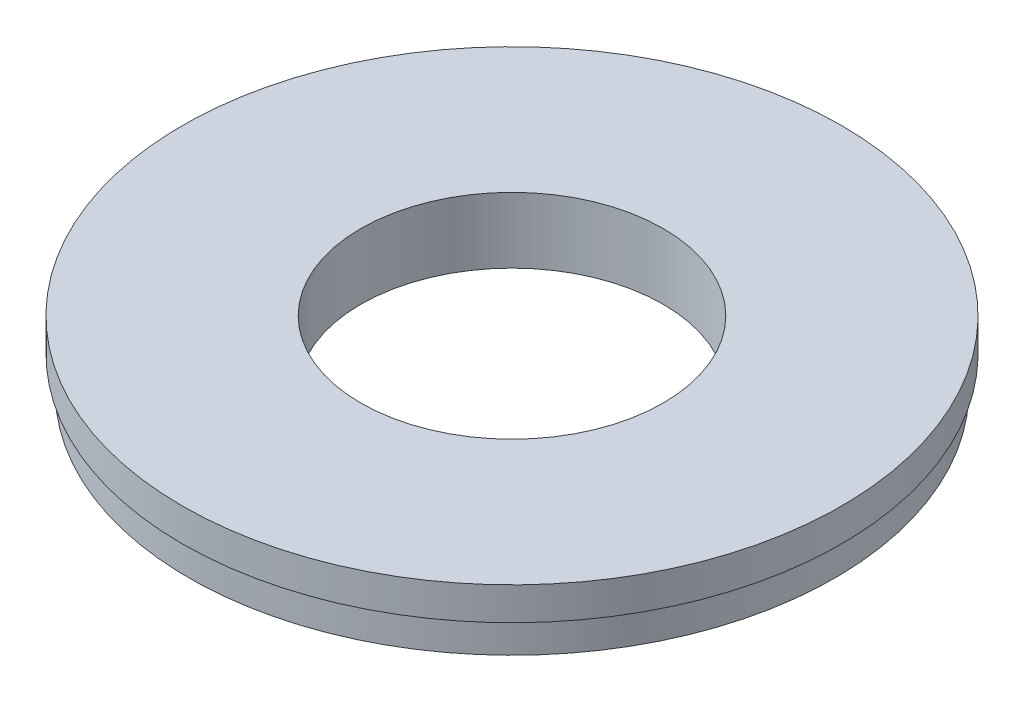
ISO-10303-21;
HEADER;
FILE_DESCRIPTION(('STEP AP214'),'2;1');
FILE_NAME('part.step','',(''),(''),'','','');
FILE_SCHEMA(('AUTOMOTIVE_DESIGN { 1 0 10303 214 1 1 1 1 }'));
ENDSEC;
DATA;
#1=APPLICATION_CONTEXT('core data for automotive mechanical design processes');
#2=APPLICATION_PROTOCOL_DEFINITION('international standard','automotive_design',2000,#1);
#3=PRODUCT_CONTEXT('',#1,'mechanical');
#4=PRODUCT('Part','Part','',(#3));
#5=PRODUCT_RELATED_PRODUCT_CATEGORY('part','',(#4));
#6=PRODUCT_DEFINITION_FORMATION('','',#4);
#7=PRODUCT_DEFINITION_CONTEXT('part definition',#1,'design');
#8=PRODUCT_DEFINITION('design','',#6,#7);
#9=PRODUCT_DEFINITION_SHAPE('','',#8);
#10=(LENGTH_UNIT() NAMED_UNIT(*) SI_UNIT(.MILLI.,.METRE.));
#11=(NAMED_UNIT(*) PLANE_ANGLE_UNIT() SI_UNIT($,.RADIAN.));
#12=(NAMED_UNIT(*) SI_UNIT($,.STERADIAN.) SOLID_ANGLE_UNIT());
#13=UNCERTAINTY_MEASURE_WITH_UNIT(LENGTH_MEASURE(1.E-05),#10,'distance_accuracy_value','');
#14=(GEOMETRIC_REPRESENTATION_CONTEXT(3) GLOBAL_UNCERTAINTY_ASSIGNED_CONTEXT((#13)) GLOBAL_UNIT_ASSIGNED_CONTEXT((#10,
#11,#12)) REPRESENTATION_CONTEXT('',''));
#15=CARTESIAN_POINT('',(0.,0.,0.));
#16=DIRECTION('',(0.,0.,1.));
#17=DIRECTION('',(1.,0.,0.));
#18=AXIS2_PLACEMENT_3D('',#15,#16,#17);
#19=CARTESIAN_POINT('',(59.944,5.969,0.));
#20=DIRECTION('',(0.,-1.,0.));
#21=DIRECTION('',(0.,0.,-1.));
#22=AXIS2_PLACEMENT_3D('',#19,#20,#21);
#23=PLANE('',#22);
#24=CARTESIAN_POINT('',(0.,5.969,0.));
#25=DIRECTION('',(0.,-1.,0.));
#26=DIRECTION('',(0.,0.,-1.));
#27=AXIS2_PLACEMENT_3D('',#24,#25,#26);
#28=CIRCLE('',#27,59.944);
#29=CARTESIAN_POINT('',(0.,5.969,-59.944));
#30=VERTEX_POINT('',#29);
#31=EDGE_CURVE('E10',#30,#30,#28,.T.);
#32=ORIENTED_EDGE('',*,*,#31,.T.);
#33=EDGE_LOOP('',(#32));
#34=FACE_BOUND('',#33,.T.);
#35=CARTESIAN_POINT('',(0.,5.969,0.));
#36=DIRECTION('',(0.,-1.,0.));
#37=DIRECTION('',(0.,0.,-1.));
#38=AXIS2_PLACEMENT_3D('',#35,#36,#37);
#39=CIRCLE('',#38,58.7502);
#40=CARTESIAN_POINT('',(0.,5.969,-58.7502));
#41=VERTEX_POINT('',#40);
#42=EDGE_CURVE('E54',#41,#41,#39,.T.);
#43=ORIENTED_EDGE('',*,*,#42,.F.);
#44=EDGE_LOOP('',(#43));
#45=FACE_BOUND('',#44,.T.);
#46=ADVANCED_FACE('F32',(#34,#45),#23,.T.);
#47=CARTESIAN_POINT('',(0.,0.,0.));
#48=DIRECTION('',(0.,-1.,0.));
#49=DIRECTION('',(0.,0.,-1.));
#50=AXIS2_PLACEMENT_3D('',#47,#48,#49);
#51=CYLINDRICAL_SURFACE('',#50,59.944);
#52=CARTESIAN_POINT('',(0.,11.938,0.));
#53=DIRECTION('',(0.,-1.,0.));
#54=DIRECTION('',(0.,0.,-1.));
#55=AXIS2_PLACEMENT_3D('',#52,#53,#54);
#56=CIRCLE('',#55,59.944);
#57=CARTESIAN_POINT('',(0.,11.938,-59.944));
#58=VERTEX_POINT('',#57);
#59=EDGE_CURVE('E38',#58,#58,#56,.T.);
#60=ORIENTED_EDGE('',*,*,#59,.T.);
#61=EDGE_LOOP('',(#60));
#62=FACE_BOUND('',#61,.T.);
#63=ORIENTED_EDGE('',*,*,#31,.F.);
#64=EDGE_LOOP('',(#63));
#65=FACE_BOUND('',#64,.T.);
#66=ADVANCED_FACE('F62',(#62,#65),#51,.T.);
#67=CARTESIAN_POINT('',(27.5,11.938,0.));
#68=DIRECTION('',(0.,1.,0.));
#69=DIRECTION('',(0.,0.,1.));
#70=AXIS2_PLACEMENT_3D('',#67,#68,#69);
#71=PLANE('',#70);
#72=CARTESIAN_POINT('',(0.,11.938,0.));
#73=DIRECTION('',(0.,-1.,0.));
#74=DIRECTION('',(0.,0.,-1.));
#75=AXIS2_PLACEMENT_3D('',#72,#73,#74);
#76=CIRCLE('',#75,27.5);
#77=CARTESIAN_POINT('',(0.,11.938,-27.5));
#78=VERTEX_POINT('',#77);
#79=EDGE_CURVE('E42',#78,#78,#76,.T.);
#80=ORIENTED_EDGE('',*,*,#79,.T.);
#81=EDGE_LOOP('',(#80));
#82=FACE_BOUND('',#81,.T.);
#83=ORIENTED_EDGE('',*,*,#59,.F.);
#84=EDGE_LOOP('',(#83));
#85=FACE_BOUND('',#84,.T.);
#86=ADVANCED_FACE('F66',(#82,#85),#71,.T.);
#87=CARTESIAN_POINT('',(0.,0.,0.));
#88=DIRECTION('',(0.,-1.,0.));
#89=DIRECTION('',(0.,0.,-1.));
#90=AXIS2_PLACEMENT_3D('',#87,#88,#89);
#91=CYLINDRICAL_SURFACE('',#90,27.5);
#92=CARTESIAN_POINT('',(0.,0.,0.));
#93=DIRECTION('',(0.,-1.,0.));
#94=DIRECTION('',(0.,0.,-1.));
#95=AXIS2_PLACEMENT_3D('',#92,#93,#94);
#96=CIRCLE('',#95,27.5);
#97=CARTESIAN_POINT('',(0.,0.,-27.5));
#98=VERTEX_POINT('',#97);
#99=EDGE_CURVE('E46',#98,#98,#96,.T.);
#100=ORIENTED_EDGE('',*,*,#99,.T.);
#101=EDGE_LOOP('',(#100));
#102=FACE_BOUND('',#101,.T.);
#103=ORIENTED_EDGE('',*,*,#79,.F.);
#104=EDGE_LOOP('',(#103));
#105=FACE_BOUND('',#104,.T.);
#106=ADVANCED_FACE('F70',(#102,#105),#91,.F.);
#107=CARTESIAN_POINT('',(27.5,0.,0.));
#108=DIRECTION('',(0.,-1.,0.));
#109=DIRECTION('',(0.,0.,-1.));
#110=AXIS2_PLACEMENT_3D('',#107,#108,#109);
#111=PLANE('',#110);
#112=CARTESIAN_POINT('',(0.,0.,0.));
#113=DIRECTION('',(0.,-1.,0.));
#114=DIRECTION('',(0.,0.,-1.));
#115=AXIS2_PLACEMENT_3D('',#112,#113,#114);
#116=CIRCLE('',#115,58.7502);
#117=CARTESIAN_POINT('',(0.,0.,-58.7502));
#118=VERTEX_POINT('',#117);
#119=EDGE_CURVE('E51',#118,#118,#116,.T.);
#120=ORIENTED_EDGE('',*,*,#119,.T.);
#121=EDGE_LOOP('',(#120));
#122=FACE_BOUND('',#121,.T.);
#123=ORIENTED_EDGE('',*,*,#99,.F.);
#124=EDGE_LOOP('',(#123));
#125=FACE_BOUND('',#124,.T.);
#126=ADVANCED_FACE('F77',(#122,#125),#111,.T.);
#127=CARTESIAN_POINT('',(0.,0.,0.));
#128=DIRECTION('',(0.,-1.,0.));
#129=DIRECTION('',(0.,0.,-1.));
#130=AXIS2_PLACEMENT_3D('',#127,#128,#129);
#131=CYLINDRICAL_SURFACE('',#130,58.7502);
#132=ORIENTED_EDGE('',*,*,#42,.T.);
#133=EDGE_LOOP('',(#132));
#134=FACE_BOUND('',#133,.T.);
#135=ORIENTED_EDGE('',*,*,#119,.F.);
#136=EDGE_LOOP('',(#135));
#137=FACE_BOUND('',#136,.T.);
#138=ADVANCED_FACE('F58',(#134,#137),#131,.T.);
#139=CLOSED_SHELL('',(#46,#66,#86,#106,#126,#138));
#140=MANIFOLD_SOLID_BREP('B2',#139);
#141=ADVANCED_BREP_SHAPE_REPRESENTATION('',(#18,#140),#14);
#142=SHAPE_DEFINITION_REPRESENTATION(#9,#141);
ENDSEC;
END-ISO-10303-21;
